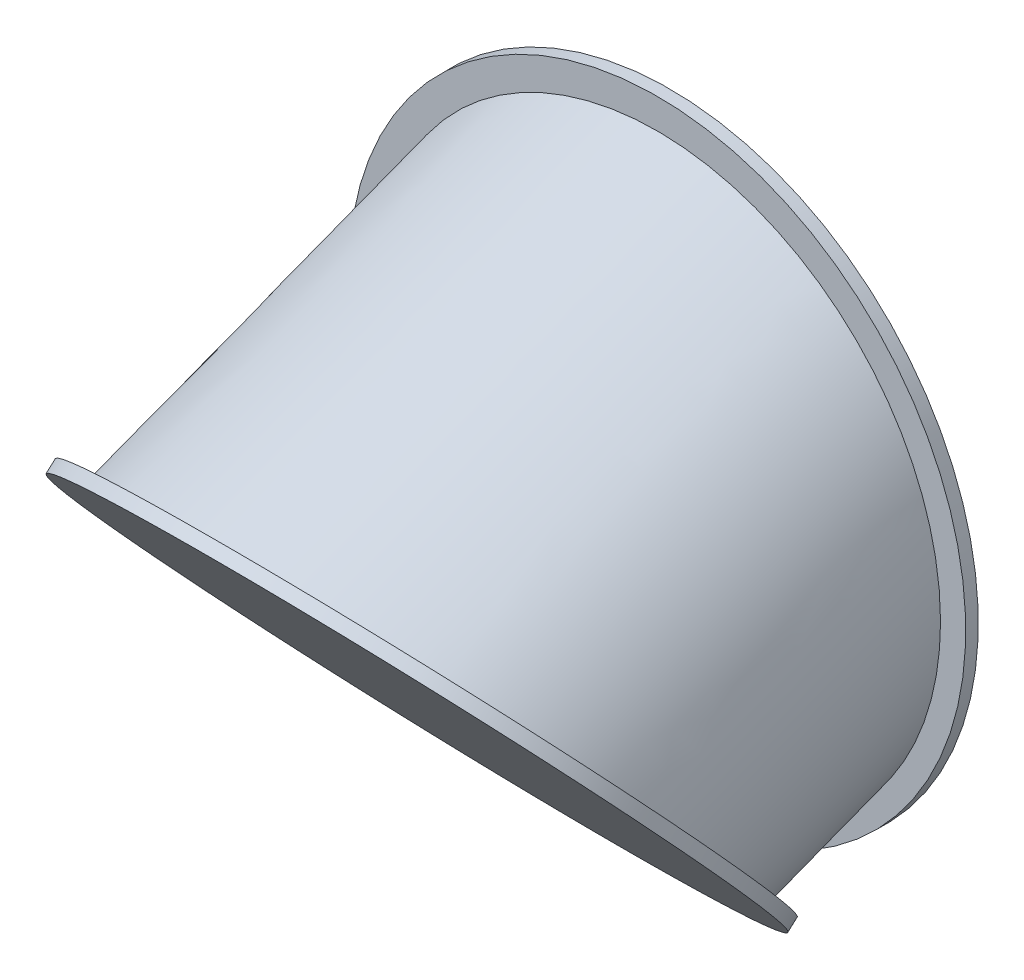
ISO-10303-21;
HEADER;
FILE_DESCRIPTION(('STEP AP214'),'2;1');
FILE_NAME('part.step','',(''),(''),'','','');
FILE_SCHEMA(('AUTOMOTIVE_DESIGN { 1 0 10303 214 1 1 1 1 }'));
ENDSEC;
DATA;
#1=APPLICATION_CONTEXT('core data for automotive mechanical design processes');
#2=APPLICATION_PROTOCOL_DEFINITION('international standard','automotive_design',2000,#1);
#3=PRODUCT_CONTEXT('',#1,'mechanical');
#4=PRODUCT('Part','Part','',(#3));
#5=PRODUCT_RELATED_PRODUCT_CATEGORY('part','',(#4));
#6=PRODUCT_DEFINITION_FORMATION('','',#4);
#7=PRODUCT_DEFINITION_CONTEXT('part definition',#1,'design');
#8=PRODUCT_DEFINITION('design','',#6,#7);
#9=PRODUCT_DEFINITION_SHAPE('','',#8);
#10=(LENGTH_UNIT() NAMED_UNIT(*) SI_UNIT(.MILLI.,.METRE.));
#11=(NAMED_UNIT(*) PLANE_ANGLE_UNIT() SI_UNIT($,.RADIAN.));
#12=(NAMED_UNIT(*) SI_UNIT($,.STERADIAN.) SOLID_ANGLE_UNIT());
#13=UNCERTAINTY_MEASURE_WITH_UNIT(LENGTH_MEASURE(1.E-05),#10,'distance_accuracy_value','');
#14=(GEOMETRIC_REPRESENTATION_CONTEXT(3) GLOBAL_UNCERTAINTY_ASSIGNED_CONTEXT((#13)) GLOBAL_UNIT_ASSIGNED_CONTEXT((#10,
#11,#12)) REPRESENTATION_CONTEXT('',''));
#15=CARTESIAN_POINT('',(0.,0.,0.));
#16=DIRECTION('',(0.,0.,1.));
#17=DIRECTION('',(1.,0.,0.));
#18=AXIS2_PLACEMENT_3D('',#15,#16,#17);
#19=CARTESIAN_POINT('',(11.25,0.,0.));
#20=CARTESIAN_POINT('',(11.25,-8.95919873863236,23.3395106624301));
#21=CARTESIAN_POINT('',(11.25,22.5,0.));
#22=CARTESIAN_POINT('',(11.25,13.5408012613676,23.3395106624301));
#23=CARTESIAN_POINT('',(-11.25,22.5,0.));
#24=CARTESIAN_POINT('',(-11.25,13.5408012613676,23.3395106624301));
#25=CARTESIAN_POINT('',(-11.25,0.,0.));
#26=CARTESIAN_POINT('',(-11.25,-8.95919873863236,23.3395106624301));
#27=CARTESIAN_POINT('',(-11.25,-22.5,0.));
#28=CARTESIAN_POINT('',(-11.25,-31.4591987386324,23.3395106624301));
#29=CARTESIAN_POINT('',(11.25,-22.5,0.));
#30=CARTESIAN_POINT('',(11.25,-31.4591987386324,23.3395106624301));
#31=CARTESIAN_POINT('',(11.25,0.,0.));
#32=CARTESIAN_POINT('',(11.25,-8.95919873863236,23.3395106624301));
#33=(BOUNDED_SURFACE() B_SPLINE_SURFACE(3,1,((#19,#20),(#21,#22),(#23,#24),(#25,#26),(#27,#28),
(#29,#30),(#31,#32)),.UNSPECIFIED.,.T.,.F.,.F.) B_SPLINE_SURFACE_WITH_KNOTS((4,3,4),(2,2),(0.,
0.5,1.),(0.,1.),.UNSPECIFIED.) GEOMETRIC_REPRESENTATION_ITEM() RATIONAL_B_SPLINE_SURFACE(((1.,
1.),(0.333333333333333,0.333333333333333),(0.333333333333333,0.333333333333333),(1.,1.),
(0.333333333333333,0.333333333333333),(0.333333333333333,0.333333333333333),(1.,1.))) REPRESENTATION_ITEM('') SURFACE());
#34=CARTESIAN_POINT('',(11.25,-3.66089560032134,9.53695909538294));
#35=CARTESIAN_POINT('',(11.2500022678552,-3.89578323319594,9.3254653207871));
#36=CARTESIAN_POINT('',(11.2366742815925,-4.13064320830581,9.11399644935448));
#37=CARTESIAN_POINT('',(11.1834553768566,-4.59877220694964,8.69249120572248));
#38=CARTESIAN_POINT('',(11.1435574702997,-4.83204079562755,8.48245522506924));
#39=CARTESIAN_POINT('',(11.037415249348,-5.29549852569795,8.06515601055276));
#40=CARTESIAN_POINT('',(10.9711426176828,-5.52568408152361,7.85789600514838));
#41=CARTESIAN_POINT('',(10.8127241551556,-5.98108472320207,7.44785142560527));
#42=CARTESIAN_POINT('',(10.7205784178198,-6.20629982701887,7.24506683529167));
#43=CARTESIAN_POINT('',(10.5111201408936,-6.65004849572931,6.845513739333));
#44=CARTESIAN_POINT('',(10.393819807899,-6.86858524282454,6.64874236842076));
#45=CARTESIAN_POINT('',(10.1348581064416,-7.2975408770333,6.26250898055484));
#46=CARTESIAN_POINT('',(9.99319635331252,-7.50795963589971,6.07304707907539));
#47=CARTESIAN_POINT('',(9.68655962197015,-7.91912670336061,5.70283058865151));
#48=CARTESIAN_POINT('',(9.52159059470481,-8.11987746295502,5.52207379281684));
#49=CARTESIAN_POINT('',(9.16948533623532,-8.51033830545141,5.17050127109315));
#50=CARTESIAN_POINT('',(8.98234919175702,-8.70004843154406,4.99968550631508));
#51=CARTESIAN_POINT('',(8.58721825651825,-9.06709997242238,4.66919081444248));
#52=CARTESIAN_POINT('',(8.37922125107709,-9.24444007055577,4.509513072867));
#53=CARTESIAN_POINT('',(7.94386363814367,-9.58546883903164,4.20244939050941));
#54=CARTESIAN_POINT('',(7.71650301102852,-9.74915749553955,4.05506346218401));
#55=CARTESIAN_POINT('',(7.24402545928768,-10.0617255912716,3.77362588466837));
#56=CARTESIAN_POINT('',(6.99890784389394,-10.2106044538419,3.63957475469963));
#57=CARTESIAN_POINT('',(6.49266689725298,-10.4924872072486,3.38576638351445));
#58=CARTESIAN_POINT('',(6.23154356913934,-10.6254911011929,3.26600913949958));
#59=CARTESIAN_POINT('',(5.69515264047243,-10.8746760227673,3.04164202833597));
#60=CARTESIAN_POINT('',(5.41988530265197,-10.9908573627326,2.93703187995926));
#61=CARTESIAN_POINT('',(4.8571588791173,-11.2055741379935,2.74370002713583));
#62=CARTESIAN_POINT('',(4.56969979317839,-11.3041095729638,2.65497832298192));
#63=CARTESIAN_POINT('',(3.98463413809857,-11.4828338245604,2.49405428403021));
#64=CARTESIAN_POINT('',(3.68702758948754,-11.5630226783021,2.42185191581354));
#65=CARTESIAN_POINT('',(3.08378225775543,-11.7044839293051,2.29447963329907));
#66=CARTESIAN_POINT('',(2.7781434746436,-11.765756326588,2.23930971898167));
#67=CARTESIAN_POINT('',(2.16100598787761,-11.8689491541492,2.14639447970304));
#68=CARTESIAN_POINT('',(1.84950727302932,-11.9108695474558,2.10864918803128));
#69=CARTESIAN_POINT('',(1.2228650637088,-11.9750601649681,2.05085169641719));
#70=CARTESIAN_POINT('',(0.907721569237623,-11.9973303891795,2.03079949646978));
#71=CARTESIAN_POINT('',(0.276030856508695,-12.0220623180334,2.00853076770645));
#72=CARTESIAN_POINT('',(-0.040516359215199,-12.0245240584176,2.00631420670856));
#73=CARTESIAN_POINT('',(-0.672764622551567,-12.0096216120364,2.01973242970009));
#74=CARTESIAN_POINT('',(-0.988465670165066,-11.9922574252951,2.03536721366788));
#75=CARTESIAN_POINT('',(-1.61677727383375,-11.9378265632173,2.08437698201742));
#76=CARTESIAN_POINT('',(-1.92938782873379,-11.9007598805167,2.11775197302971));
#77=CARTESIAN_POINT('',(-2.54929585605494,-11.8071875435748,2.20200488364661));
#78=CARTESIAN_POINT('',(-2.85659332846903,-11.7506818893077,2.25288280327435));
#79=CARTESIAN_POINT('',(-3.46369081292696,-11.6186332602735,2.37177992290075));
#80=CARTESIAN_POINT('',(-3.76349081704884,-11.5430902653921,2.43979914101036));
#81=CARTESIAN_POINT('',(-4.35346162745393,-11.3735040506772,2.59249525459677));
#82=CARTESIAN_POINT('',(-4.64363243373218,-11.2794608308343,2.67717215008214));
#83=CARTESIAN_POINT('',(-5.21228181285282,-11.0735427914594,2.86258158552916));
#84=CARTESIAN_POINT('',(-5.49076038950559,-10.9616679777387,2.96331412025839));
#85=CARTESIAN_POINT('',(-6.03404559296578,-10.7208820919552,3.18011870562768));
#86=CARTESIAN_POINT('',(-6.29885221978325,-10.591971019905,3.29619075625646));
#87=CARTESIAN_POINT('',(-6.81291080227077,-10.3180291537856,3.54284912041286));
#88=CARTESIAN_POINT('',(-7.06216276424141,-10.172998366246,3.67343542806124));
#89=CARTESIAN_POINT('',(-7.54334010251075,-9.86784810831447,3.94819395442129));
#90=CARTESIAN_POINT('',(-7.7752654788114,-9.7077286379243,4.09236617313143));
#91=CARTESIAN_POINT('',(-8.22014082646417,-9.37353934434707,4.3932715646294));
#92=CARTESIAN_POINT('',(-8.43309079521251,-9.19946951924577,4.55000473914084));
#93=CARTESIAN_POINT('',(-8.83850134558169,-8.838617067355,4.87491774621807));
#94=CARTESIAN_POINT('',(-9.03096192719747,-8.65183444056241,5.0430975787867));
#95=CARTESIAN_POINT('',(-9.39402544771197,-8.26688427247879,5.38970826698233));
#96=CARTESIAN_POINT('',(-9.56462838375228,-8.0687167296989,5.5681391239499));
#97=CARTESIAN_POINT('',(-9.88276369887006,-7.66240560456734,5.93398330426157));
#98=CARTESIAN_POINT('',(-10.0302960779466,-7.45426202221526,6.12139662760602));
#99=CARTESIAN_POINT('',(-10.3012414063335,-7.02947860339864,6.50387333585917));
#100=CARTESIAN_POINT('',(-10.4246543566777,-6.81283876729834,6.6989367204399));
#101=CARTESIAN_POINT('',(-10.646483443318,-6.37260301212593,7.09532677484165));
#102=CARTESIAN_POINT('',(-10.7448995796161,-6.14900709305439,7.29665344466216));
#103=CARTESIAN_POINT('',(-10.9160353544951,-5.69644881522376,7.70413874830133));
#104=CARTESIAN_POINT('',(-10.9887549942344,-5.46748645670659,7.91029738190216));
#105=CARTESIAN_POINT('',(-11.1079807891528,-5.00582307538019,8.32598095755267));
#106=CARTESIAN_POINT('',(-11.1544869443325,-4.77312205257107,8.53550589960225));
#107=CARTESIAN_POINT('',(-11.2209551392363,-4.30563570743227,8.95643249541924));
#108=CARTESIAN_POINT('',(-11.2409171789604,-4.0708503851026,9.16783414918665));
#109=CARTESIAN_POINT('',(-11.2541552248224,-3.60086462381673,9.59101122941084));
#110=CARTESIAN_POINT('',(-11.2474312309596,-3.36566418486053,9.80278665586764));
#111=CARTESIAN_POINT('',(-11.2073450123024,-2.89652031386638,10.2252056946683));
#112=CARTESIAN_POINT('',(-11.1739827863072,-2.6625768818851,10.4358493069612));
#113=CARTESIAN_POINT('',(-11.0808572873355,-2.19761023323667,10.8545071578678));
#114=CARTESIAN_POINT('',(-11.021094014357,-1.96658701656975,11.0625213964814));
#115=CARTESIAN_POINT('',(-10.8755912993729,-1.50910322547974,11.4744416521796));
#116=CARTESIAN_POINT('',(-10.7898518562538,-1.28264265125225,11.678347669088));
#117=CARTESIAN_POINT('',(-10.5930063580493,-0.835894154457032,12.0806018223864));
#118=CARTESIAN_POINT('',(-10.481900302965,-0.615606231889078,12.2789499587766));
#119=CARTESIAN_POINT('',(-10.2351114945383,-0.182769182102589,12.6686781889263));
#120=CARTESIAN_POINT('',(-10.0994287444099,0.0297799461279741,12.8600582835971));
#121=CARTESIAN_POINT('',(-9.80445115917591,0.445628340815452,13.2344898599884));
#122=CARTESIAN_POINT('',(-9.64515632407603,0.648927607274656,13.4175413417111));
#123=CARTESIAN_POINT('',(-9.30408708296652,1.0448309154749,13.7740142815655));
#124=CARTESIAN_POINT('',(-9.12231268004149,1.23743495868351,13.9474357410186));
#125=CARTESIAN_POINT('',(-8.73757659264214,1.61057855174351,14.2834157413137));
#126=CARTESIAN_POINT('',(-8.53461490816545,1.79111810159354,14.4459742821544));
#127=CARTESIAN_POINT('',(-8.10894710667597,2.13884925086652,14.7590728152881));
#128=CARTESIAN_POINT('',(-7.88624098166545,2.30604084488267,14.9096128027128));
#129=CARTESIAN_POINT('',(-7.42266767708822,2.62588736875318,15.1976039063604));
#130=CARTESIAN_POINT('',(-7.18180049750815,2.77854229859685,15.3350550225737));
#131=CARTESIAN_POINT('',(-6.68361742464703,3.06823025570372,15.5958912307371));
#132=CARTESIAN_POINT('',(-6.4263015260055,3.20526327787585,15.7192763181032));
#133=CARTESIAN_POINT('',(-5.89705044943415,3.46273313845017,15.9511032218492));
#134=CARTESIAN_POINT('',(-5.62511527151187,3.58316997686092,16.0595450382366));
#135=CARTESIAN_POINT('',(-5.06855922886471,3.80659111715842,16.2607143365421));
#136=CARTESIAN_POINT('',(-4.78393837754349,3.9095754374849,16.3534418350634));
#137=CARTESIAN_POINT('',(-4.20403420249782,4.09735954057194,16.5225234009378));
#138=CARTESIAN_POINT('',(-3.90875087878745,4.18215932335652,16.5988774683126));
#139=CARTESIAN_POINT('',(-3.30962115604947,4.33297144825111,16.7346693154968));
#140=CARTESIAN_POINT('',(-3.00577476022242,4.39898379738307,16.7941071016289));
#141=CARTESIAN_POINT('',(-2.39167894926367,4.51175178992101,16.8956438581774));
#142=CARTESIAN_POINT('',(-2.08142953412421,4.55850743330366,16.9377428285728));
#143=CARTESIAN_POINT('',(-1.45673280413545,4.63242967692218,17.0043027156905));
#144=CARTESIAN_POINT('',(-1.14228548171259,4.65959624181205,17.0287636005871));
#145=CARTESIAN_POINT('',(-0.51142902213166,4.69414705257719,17.0598732903338));
#146=CARTESIAN_POINT('',(-0.195019884973022,4.70153129844676,17.0665220951788));
#147=CARTESIAN_POINT('',(0.437510115814824,4.69646497841021,17.0619603601282));
#148=CARTESIAN_POINT('',(0.753630979993616,4.68401445039794,17.0507498543523));
#149=CARTESIAN_POINT('',(1.38333761549462,4.63936716926215,17.0105492618507));
#150=CARTESIAN_POINT('',(1.69692338681391,4.60717041611591,16.9815591751046));
#151=CARTESIAN_POINT('',(2.31933106436524,4.52325949865716,16.906005445664));
#152=CARTESIAN_POINT('',(2.62815296095852,4.47154529486034,16.8594417674177));
#153=CARTESIAN_POINT('',(3.23883668911143,4.34896714145572,16.7490719023496));
#154=CARTESIAN_POINT('',(3.54069852079936,4.27810319220088,16.6852657158456));
#155=CARTESIAN_POINT('',(4.13532159079601,4.11772785778048,16.5408631161279));
#156=CARTESIAN_POINT('',(4.42808266001004,4.02821612637162,16.4602663911552));
#157=CARTESIAN_POINT('',(5.00241696166396,3.83118240383305,16.2828564305185));
#158=CARTESIAN_POINT('',(5.28399019191349,3.72366040917731,16.1860431916795));
#159=CARTESIAN_POINT('',(5.83393614359045,3.49137514755833,15.9768926026869));
#160=CARTESIAN_POINT('',(6.10230937836295,3.36661255179848,15.8645558568877));
#161=CARTESIAN_POINT('',(6.62395892488342,3.10072998915161,15.6251541221722));
#162=CARTESIAN_POINT('',(6.87723525193036,2.95961003884131,15.4980891481817));
#163=CARTESIAN_POINT('',(7.36686466113415,2.66203173261018,15.2301484377559));
#164=CARTESIAN_POINT('',(7.60321953879147,2.50557500822942,15.0892741703658));
#165=CARTESIAN_POINT('',(8.05735664801973,2.17842200445667,14.7947042826647));
#166=CARTESIAN_POINT('',(8.27513880692623,2.00772566935837,14.6410086121953));
#167=CARTESIAN_POINT('',(8.690634538264,1.65326195477987,14.321848050032));
#168=CARTESIAN_POINT('',(8.88834298043942,1.46949125418046,14.1563801679888));
#169=CARTESIAN_POINT('',(9.26221903888033,1.09022736583758,13.8148894290688));
#170=CARTESIAN_POINT('',(9.43838699525153,0.894734363251832,13.6388667389087));
#171=CARTESIAN_POINT('',(9.76801294428298,0.493315716627858,13.2774277660319));
#172=CARTESIAN_POINT('',(9.92145989481074,0.28738506484921,13.0920069743255));
#173=CARTESIAN_POINT('',(10.2044499282248,-0.133355257552249,12.713170686436));
#174=CARTESIAN_POINT('',(10.3339929247024,-0.348164960267857,12.5197551613565));
#175=CARTESIAN_POINT('',(10.5681269487923,-0.784903487146056,12.1265140254547));
#176=CARTESIAN_POINT('',(10.6727446600143,-1.00682440695753,11.9266955317421));
#177=CARTESIAN_POINT('',(10.856437713555,-1.4563505826291,11.5219403451497));
#178=CARTESIAN_POINT('',(10.9355197673519,-1.68395432791487,11.3170050123971));
#179=CARTESIAN_POINT('',(11.0840654859646,-2.20051877615799,10.8518882940585));
#180=CARTESIAN_POINT('',(11.1462381213326,-2.49065324853347,10.5906500417414));
#181=CARTESIAN_POINT('',(11.2292039622394,-3.07417139274839,10.0652479447691));
#182=CARTESIAN_POINT('',(11.2499971677782,-3.36755506458783,9.80108410011388));
#183=CARTESIAN_POINT('',(11.25,-3.66089560032134,9.53695909538294));
#184=B_SPLINE_CURVE_WITH_KNOTS('',3,(#34,#35,#36,#37,#38,#39,#40,#41,#42,#43,#44,#45,#46,#47,
#48,#49,#50,#51,#52,#53,#54,#55,#56,#57,#58,#59,#60,#61,#62,#63,#64,#65,#66,#67,#68,#69,#70,#71,
#72,#73,#74,#75,#76,#77,#78,#79,#80,#81,#82,#83,#84,#85,#86,#87,#88,#89,#90,#91,#92,#93,#94,#95,
#96,#97,#98,#99,#100,#101,#102,#103,#104,#105,#106,#107,#108,#109,#110,#111,#112,#113,#114,#115,
#116,#117,#118,#119,#120,#121,#122,#123,#124,#125,#126,#127,#128,#129,#130,#131,#132,#133,#134,
#135,#136,#137,#138,#139,#140,#141,#142,#143,#144,#145,#146,#147,#148,#149,#150,#151,#152,#153,
#154,#155,#156,#157,#158,#159,#160,#161,#162,#163,#164,#165,#166,#167,#168,#169,#170,#171,#172,
#173,#174,#175,#176,#177,#178,#179,#180,#181,#182,#183),.UNSPECIFIED.,.T.,.F.,(4,2,2,2,2,2,2,2,
2,2,2,2,2,2,2,2,2,2,2,2,2,2,2,2,2,2,2,2,2,2,2,2,2,2,2,2,2,2,2,2,2,2,2,2,2,2,2,2,2,2,2,2,2,2,2,2,
2,2,2,2,2,2,2,2,2,2,2,2,2,2,2,2,2,2,4),(0.,0.947872664858294,1.89599472568545,2.84513749761526,
3.79427683862932,4.74295663544547,5.69165141327367,6.64010440115344,7.58855367846108,
8.53710375411264,9.48565479102621,10.4342427475432,11.3828305183476,12.3314006749752,
13.2799708490844,14.2285391042042,15.1771073582326,16.1256774244784,17.0742474904514,
18.0228158448588,18.9713841981165,19.9199529059087,20.8685216149548,21.8170913262336,
22.7656610380011,23.714230440638,24.6627998425779,25.6113688602858,26.5599378778873,
27.5085070256504,28.4570761736474,29.4056454456922,30.3542147177737,31.3027839491883,
32.2513531805263,33.1999223691042,34.1484915576585,35.0970607462124,36.0456299347904,
36.9941991661286,37.9427683975425,38.8913376696233,39.8399069416684,40.7884760896655,
41.737045237428,42.6856142550296,43.6341832727376,44.5827526746773,45.5313220773147,
46.479891789083,47.4284615003615,48.3770302094073,49.3255989172003,50.2741672704584,
51.2227356248656,52.1713056908387,53.1198757570845,54.0684440111122,55.0170122662322,
55.9655824403418,56.9141525969686,57.8627403677721,58.8113283242894,59.7598793612029,
60.708429436854,61.6568787141623,62.6053317020414,63.5540264798676,64.5027062766858,
65.4518456177057,66.4009883896331,67.3491104504593,68.296983115322,69.4807383940221,
70.6644936727221),.UNSPECIFIED.);
#185=CARTESIAN_POINT('',(11.25,-3.66089560032134,9.53695909538294));
#186=VERTEX_POINT('',#185);
#187=EDGE_CURVE('E11',#186,#186,#184,.T.);
#188=CARTESIAN_POINT('',(11.25,-0.191932017517705,0.5));
#189=CARTESIAN_POINT('',(11.2499966427254,0.119566909473019,0.500000000000001));
#190=CARTESIAN_POINT('',(11.2370499644495,0.431151104450768,0.5));
#191=CARTESIAN_POINT('',(11.1853110520358,1.05253050451887,0.5));
#192=CARTESIAN_POINT('',(11.1464850111786,1.36232283422347,0.5));
#193=CARTESIAN_POINT('',(11.0425517941983,1.98163577019439,0.5));
#194=CARTESIAN_POINT('',(10.9771086813149,2.29110021084866,0.5));
#195=CARTESIAN_POINT('',(10.8203758359961,2.90353633570823,0.5));
#196=CARTESIAN_POINT('',(10.7290761122497,3.20650546126776,0.5));
#197=CARTESIAN_POINT('',(10.5211790966431,3.80399685028117,0.5));
#198=CARTESIAN_POINT('',(10.4045551595557,4.09850984412173,0.5));
#199=CARTESIAN_POINT('',(10.1468963230099,4.67665674421297,0.5));
#200=CARTESIAN_POINT('',(10.0058613995766,4.96029063977853,0.5));
#201=CARTESIAN_POINT('',(9.7004607661331,5.51452234986534,0.5));
#202=CARTESIAN_POINT('',(9.53610670871982,5.78512658540836,0.5));
#203=CARTESIAN_POINT('',(9.18517956579498,6.31153181364271,0.5));
#204=CARTESIAN_POINT('',(8.99860595589058,6.56733245674989,0.5));
#205=CARTESIAN_POINT('',(8.60462639124827,7.06223317198781,0.5));
#206=CARTESIAN_POINT('',(8.39722644283955,7.30133802566082,0.5));
#207=CARTESIAN_POINT('',(7.96302484299537,7.76122723103165,0.5));
#208=CARTESIAN_POINT('',(7.73622330407203,7.98201168895697,0.5));
#209=CARTESIAN_POINT('',(7.26480209820096,8.40371690319155,0.5));
#210=CARTESIAN_POINT('',(7.02018036796768,8.60463535297441,0.5));
#211=CARTESIAN_POINT('',(6.51488067197397,8.98515139988143,0.5));
#212=CARTESIAN_POINT('',(6.25420268278073,9.16474896588836,0.5));
#213=CARTESIAN_POINT('',(5.71863039813244,9.5013546636152,0.5));
#214=CARTESIAN_POINT('',(5.44373538452234,9.65836165268253,0.5));
#215=CARTESIAN_POINT('',(4.88169568935884,9.94865906355146,0.5));
#216=CARTESIAN_POINT('',(4.59455101126617,10.0819494920533,0.5));
#217=CARTESIAN_POINT('',(4.01006003053129,10.3238634501861,0.5));
#218=CARTESIAN_POINT('',(3.7127139577731,10.4324875352427,0.5));
#219=CARTESIAN_POINT('',(3.10992801485678,10.6243003907354,0.5));
#220=CARTESIAN_POINT('',(2.80448814447033,10.707489160454,0.5));
#221=CARTESIAN_POINT('',(2.18768793516424,10.8478395424021,0.5));
#222=CARTESIAN_POINT('',(1.87632763099108,10.9050013073325,0.5));
#223=CARTESIAN_POINT('',(1.24989838547916,10.9928920141321,0.5));
#224=CARTESIAN_POINT('',(0.934829444157716,11.0236209561246,0.5));
#225=CARTESIAN_POINT('',(0.30322182330229,11.0584276112504,0.5));
#226=CARTESIAN_POINT('',(-0.0133168610558856,11.062505236843,0.5));
#227=CARTESIAN_POINT('',(-0.645612537953599,11.0439800372613,0.5));
#228=CARTESIAN_POINT('',(-0.961369530491453,11.0213772120294,0.5));
#229=CARTESIAN_POINT('',(-1.58985675467657,10.9496518289935,0.5));
#230=CARTESIAN_POINT('',(-1.902586988479,10.9005292900738,0.5));
#231=CARTESIAN_POINT('',(-2.52279760019098,10.7761137235142,0.5));
#232=CARTESIAN_POINT('',(-2.83027797810529,10.7008206958981,0.5));
#233=CARTESIAN_POINT('',(-3.43780286815756,10.524599442882,0.5));
#234=CARTESIAN_POINT('',(-3.73784738055048,10.4236712183611,0.5));
#235=CARTESIAN_POINT('',(-4.32836741558546,10.1968971089075,0.5));
#236=CARTESIAN_POINT('',(-4.61884293822161,10.0710512239593,0.5));
#237=CARTESIAN_POINT('',(-5.18816011043437,9.79533637413978,0.5));
#238=CARTESIAN_POINT('',(-5.46700175093926,9.64546739053647,0.5));
#239=CARTESIAN_POINT('',(-6.01106852011907,9.32277189299933,0.5));
#240=CARTESIAN_POINT('',(-6.27629364878702,9.14994537905373,0.5));
#241=CARTESIAN_POINT('',(-6.79124174478667,8.78256355486131,0.5));
#242=CARTESIAN_POINT('',(-7.04096471549684,8.58800824934998,0.5));
#243=CARTESIAN_POINT('',(-7.52313317710172,8.17855198368496,0.5));
#244=CARTESIAN_POINT('',(-7.75557866800665,7.96365102354331,0.5));
#245=CARTESIAN_POINT('',(-8.20153954455714,7.51503134334375,0.5));
#246=CARTESIAN_POINT('',(-8.41505493671495,7.28131262975948,0.5));
#247=CARTESIAN_POINT('',(-8.82163773965616,6.79671897790511,0.5));
#248=CARTESIAN_POINT('',(-9.01470515044175,6.54584403963686,0.5));
#249=CARTESIAN_POINT('',(-9.3790194177189,6.02872147950764,0.5));
#250=CARTESIAN_POINT('',(-9.5502662717863,5.76247385593885,0.5));
#251=CARTESIAN_POINT('',(-9.86972193819672,5.21649881136944,0.5));
#252=CARTESIAN_POINT('',(-10.0179307505348,4.93677139036594,0.5));
#253=CARTESIAN_POINT('',(-10.2902566742933,4.36582541021584,0.5));
#254=CARTESIAN_POINT('',(-10.414373782776,4.07460684966801,0.5));
#255=CARTESIAN_POINT('',(-10.6376338779828,3.48274901222406,0.5));
#256=CARTESIAN_POINT('',(-10.7367768647059,3.18210973532753,0.5));
#257=CARTESIAN_POINT('',(-10.9093838660694,2.57354784108521,0.5));
#258=CARTESIAN_POINT('',(-10.9828478815958,2.26562522399075,0.5));
#259=CARTESIAN_POINT('',(-11.1035746601598,1.64468578480127,0.5));
#260=CARTESIAN_POINT('',(-11.1508374231994,1.33166896270663,0.5));
#261=CARTESIAN_POINT('',(-11.218825685045,0.702766492355041,0.5));
#262=CARTESIAN_POINT('',(-11.2395511852566,0.38688084425004,0.5));
#263=CARTESIAN_POINT('',(-11.2543175801866,-0.245513536904068,0.5));
#264=CARTESIAN_POINT('',(-11.248358474906,-0.562022269953147,0.5));
#265=CARTESIAN_POINT('',(-11.2097980247344,-1.19341263006086,0.5));
#266=CARTESIAN_POINT('',(-11.1771966801474,-1.50829425713805,0.5));
#267=CARTESIAN_POINT('',(-11.085583527771,-2.13419178941033,0.5));
#268=CARTESIAN_POINT('',(-11.0265717199809,-2.44520769460529,0.5));
#269=CARTESIAN_POINT('',(-10.8825571742792,-3.06116266988801,0.5));
#270=CARTESIAN_POINT('',(-10.7975544343984,-3.36610173951532,0.5));
#271=CARTESIAN_POINT('',(-10.6021623446419,-3.96773508516932,0.5));
#272=CARTESIAN_POINT('',(-10.4917729947629,-4.26442936119488,0.5));
#273=CARTESIAN_POINT('',(-10.2463924784424,-4.84746382170414,0.5));
#274=CARTESIAN_POINT('',(-10.1114013102473,-5.13380400544974,0.5));
#275=CARTESIAN_POINT('',(-9.81777686910379,-5.69409455153576,0.5));
#276=CARTESIAN_POINT('',(-9.65914359615711,-5.96804491387706,0.5));
#277=CARTESIAN_POINT('',(-9.31936277035739,-6.50160813547875,0.5));
#278=CARTESIAN_POINT('',(-9.13821522241848,-6.76122099786852,0.5));
#279=CARTESIAN_POINT('',(-8.75469366971177,-7.26426359258246,0.5));
#280=CARTESIAN_POINT('',(-8.5523196649521,-7.50769332491283,0.5));
#281=CARTESIAN_POINT('',(-8.12778399617146,-7.97663897617885,0.5));
#282=CARTESIAN_POINT('',(-7.90562233587895,-8.20215489848989,0.5));
#283=CARTESIAN_POINT('',(-7.44309075883785,-8.63366969862077,0.5));
#284=CARTESIAN_POINT('',(-7.20272084208537,-8.83966857643645,0.5));
#285=CARTESIAN_POINT('',(-6.70548148908511,-9.2306848761702,0.5));
#286=CARTESIAN_POINT('',(-6.44861204302135,-9.41570228560569,0.5));
#287=CARTESIAN_POINT('',(-5.92019994861298,-9.76344014363317,0.5));
#288=CARTESIAN_POINT('',(-5.64865730025456,-9.92616059220419,0.5));
#289=CARTESIAN_POINT('',(-5.09282922708681,-10.228147726735,0.5));
#290=CARTESIAN_POINT('',(-4.80854379856656,-10.3674144058646,0.5));
#291=CARTESIAN_POINT('',(-4.22925134029979,-10.6215038399194,0.5));
#292=CARTESIAN_POINT('',(-3.93424431056293,-10.7363265948666,0.5));
#293=CARTESIAN_POINT('',(-3.33560632811045,-10.9407117383408,0.5));
#294=CARTESIAN_POINT('',(-3.03197538554777,-11.0302741566055,0.5));
#295=CARTESIAN_POINT('',(-2.41824787672993,-11.1835020722829,0.5));
#296=CARTESIAN_POINT('',(-2.1081513104785,-11.2471675697106,0.5));
#297=CARTESIAN_POINT('',(-1.48369696976011,-11.3481490502358,0.5));
#298=CARTESIAN_POINT('',(-1.1693391928034,-11.3854650179372,0.5));
#299=CARTESIAN_POINT('',(-0.538597503111475,-11.4334820845341,0.5));
#300=CARTESIAN_POINT('',(-0.222213590372416,-11.4441831833793,0.5));
#301=CARTESIAN_POINT('',(0.410331073567252,-11.4388944337464,0.5));
#302=CARTESIAN_POINT('',(0.726491824765421,-11.4229045849765,0.5));
#303=CARTESIAN_POINT('',(1.35634244692464,-11.3643476178489,0.5));
#304=CARTESIAN_POINT('',(1.67003231790452,-11.3217804996936,0.5));
#305=CARTESIAN_POINT('',(2.29270848573378,-11.2103720769693,0.5));
#306=CARTESIAN_POINT('',(2.60169482103442,-11.1415309873094,0.5));
#307=CARTESIAN_POINT('',(3.2127698732936,-10.9780640066429,0.5));
#308=CARTESIAN_POINT('',(3.51485859019241,-10.883438115413,0.5));
#309=CARTESIAN_POINT('',(4.10999564228368,-10.669072497388,0.5));
#310=CARTESIAN_POINT('',(4.40304382950331,-10.5493323597797,0.5));
#311=CARTESIAN_POINT('',(4.9780112093648,-10.285590482998,0.5));
#312=CARTESIAN_POINT('',(5.25993040230994,-10.1415887444857,0.5));
#313=CARTESIAN_POINT('',(5.8106490709415,-9.83033977192884,0.5));
#314=CARTESIAN_POINT('',(6.07944789973167,-9.66309139327568,0.5));
#315=CARTESIAN_POINT('',(6.60199987034637,-9.30654360921738,0.5));
#316=CARTESIAN_POINT('',(6.85575300562653,-9.1172441942209,0.5));
#317=CARTESIAN_POINT('',(7.34638114155395,-8.71796321809282,0.5));
#318=CARTESIAN_POINT('',(7.58325806849591,-8.50798402394464,0.5));
#319=CARTESIAN_POINT('',(8.03848135063554,-8.06881851899498,0.5));
#320=CARTESIAN_POINT('',(8.256827748567,-7.83963225248991,0.5));
#321=CARTESIAN_POINT('',(8.67338889050578,-7.36373800102964,0.5));
#322=CARTESIAN_POINT('',(8.87160840653453,-7.1170341931124,0.5));
#323=CARTESIAN_POINT('',(9.24656812199509,-6.60780729041055,0.5));
#324=CARTESIAN_POINT('',(9.42330813448997,-6.34528405797864,0.5));
#325=CARTESIAN_POINT('',(9.75414991257978,-5.80612444855462,0.5));
#326=CARTESIAN_POINT('',(9.90823809401376,-5.5294797358752,0.5));
#327=CARTESIAN_POINT('',(10.1925490188687,-4.96419920561389,0.5));
#328=CARTESIAN_POINT('',(10.322772587292,-4.67556380297477,0.5));
#329=CARTESIAN_POINT('',(10.5585506788223,-4.08805791097566,0.5));
#330=CARTESIAN_POINT('',(10.664080796671,-3.78917762789078,0.5));
#331=CARTESIAN_POINT('',(10.8495539011556,-3.18358025123311,0.5));
#332=CARTESIAN_POINT('',(10.9294971327959,-2.87686323273048,0.5));
#333=CARTESIAN_POINT('',(11.0630799993847,-2.25847967670477,0.5));
#334=CARTESIAN_POINT('',(11.1167776161875,-1.94682563432664,0.5));
#335=CARTESIAN_POINT('',(11.1977286164753,-1.32023310057764,0.5));
#336=CARTESIAN_POINT('',(11.2249969140567,-1.00529656306382,0.5));
#337=CARTESIAN_POINT('',(11.246326106432,-0.523984498227108,0.5));
#338=CARTESIAN_POINT('',(11.250001789529,-0.357970371096212,0.5));
#339=CARTESIAN_POINT('',(11.25,-0.191932017517705,0.5));
#340=B_SPLINE_CURVE_WITH_KNOTS('',3,(#188,#189,#190,#191,#192,#193,#194,#195,#196,#197,#198,
#199,#200,#201,#202,#203,#204,#205,#206,#207,#208,#209,#210,#211,#212,#213,#214,#215,#216,#217,
#218,#219,#220,#221,#222,#223,#224,#225,#226,#227,#228,#229,#230,#231,#232,#233,#234,#235,#236,
#237,#238,#239,#240,#241,#242,#243,#244,#245,#246,#247,#248,#249,#250,#251,#252,#253,#254,#255,
#256,#257,#258,#259,#260,#261,#262,#263,#264,#265,#266,#267,#268,#269,#270,#271,#272,#273,#274,
#275,#276,#277,#278,#279,#280,#281,#282,#283,#284,#285,#286,#287,#288,#289,#290,#291,#292,#293,
#294,#295,#296,#297,#298,#299,#300,#301,#302,#303,#304,#305,#306,#307,#308,#309,#310,#311,#312,
#313,#314,#315,#316,#317,#318,#319,#320,#321,#322,#323,#324,#325,#326,#327,#328,#329,#330,#331,
#332,#333,#334,#335,#336,#337,#338,#339),.UNSPECIFIED.,.T.,.F.,(4,2,2,2,2,2,2,2,2,2,2,2,2,2,2,2,
2,2,2,2,2,2,2,2,2,2,2,2,2,2,2,2,2,2,2,2,2,2,2,2,2,2,2,2,2,2,2,2,2,2,2,2,2,2,2,2,2,2,2,2,2,2,2,2,
2,2,2,2,2,2,2,2,2,2,2,4),(0.,0.934375666753729,1.86997432521442,2.81776699940733,
3.76592641317052,4.71508832233822,5.66425116371921,6.61294136697498,7.56165396424448,
8.51009373376217,9.45852800353787,10.4070722615013,11.3556179038219,12.3042115076174,
13.2528048434225,14.2013768171106,15.1499488175589,16.0985152526451,17.0470816833068,
17.9956512296913,18.9442207781197,19.8927896510837,20.8413585231908,21.7899273627754,
22.7384962029476,23.6870657827689,24.6356353630763,25.5842047366563,26.5327741096749,
27.4813431563699,28.4299122029629,29.3784813549364,30.3270505071128,31.2756197749595,
32.2241890428486,33.1727582780072,34.1213275130931,35.0698966979341,36.0184658827327,
36.967035056711,37.9156042307204,38.8641734766035,39.8127427226171,40.7613120362506,
41.7098813498167,42.6584504563415,43.6070195625034,44.555588489933,45.5041574175656,
46.4527269095312,47.4012964023898,48.34986617149,49.2984359397362,50.2470045912788,
51.1955732422746,52.1441424475218,53.0927116545638,54.0412808719734,54.9898500821585,
55.9384115336526,56.8869729933596,57.8355499706254,58.784126922043,59.7327505956632,
60.681374681899,61.629890315639,62.5784037619203,63.5266917908773,64.4749880722295,
65.4238507411108,66.3726806015154,67.3224442942921,68.2721988924381,69.2198456992475,
70.1669574359525,70.6650079391449),.UNSPECIFIED.);
#341=CARTESIAN_POINT('',(11.25,-0.191932017517704,0.5));
#342=VERTEX_POINT('',#341);
#343=EDGE_CURVE('E44',#342,#342,#340,.T.);
#344=CARTESIAN_POINT('',(11.25,-3.66089560032134,9.53695909538294));
#345=CARTESIAN_POINT('',(11.25,-3.62476056300047,9.44282410480603));
#346=CARTESIAN_POINT('',(11.25,-3.58862552567959,9.34868911422913));
#347=CARTESIAN_POINT('',(11.25,-3.51635545103785,9.16041913307532));
#348=CARTESIAN_POINT('',(11.25,-3.48022041371698,9.06628414249841));
#349=CARTESIAN_POINT('',(11.25,-3.40795033907524,8.8780141613446));
#350=CARTESIAN_POINT('',(11.25,-3.37181530175437,8.7838791707677));
#351=CARTESIAN_POINT('',(11.25,-3.29954522711262,8.59560918961389));
#352=CARTESIAN_POINT('',(11.25,-3.26341018979175,8.50147419903698));
#353=CARTESIAN_POINT('',(11.25,-3.19114011515001,8.31320421788317));
#354=CARTESIAN_POINT('',(11.25,-3.15500507782914,8.21906922730626));
#355=CARTESIAN_POINT('',(11.25,-3.0827350031874,8.03079924615245));
#356=CARTESIAN_POINT('',(11.25,-3.04659996586653,7.93666425557555));
#357=CARTESIAN_POINT('',(11.25,-2.97432989122478,7.74839427442174));
#358=CARTESIAN_POINT('',(11.25,-2.93819485390391,7.65425928384483));
#359=CARTESIAN_POINT('',(11.25,-2.86592477926217,7.46598930269102));
#360=CARTESIAN_POINT('',(11.25,-2.8297897419413,7.37185431211411));
#361=CARTESIAN_POINT('',(11.25,-2.75751966729956,7.1835843309603));
#362=CARTESIAN_POINT('',(11.25,-2.72138462997869,7.08944934038339));
#363=CARTESIAN_POINT('',(11.25,-2.64911455533694,6.90117935922958));
#364=CARTESIAN_POINT('',(11.25,-2.61297951801607,6.80704436865268));
#365=CARTESIAN_POINT('',(11.25,-2.54070944337433,6.61877438749887));
#366=CARTESIAN_POINT('',(11.25,-2.50457440605346,6.52463939692196));
#367=CARTESIAN_POINT('',(11.25,-2.43230433141172,6.33636941576815));
#368=CARTESIAN_POINT('',(11.25,-2.39616929409085,6.24223442519124));
#369=CARTESIAN_POINT('',(11.25,-2.3238992194491,6.05396444403743));
#370=CARTESIAN_POINT('',(11.25,-2.28776418212823,5.95982945346053));
#371=CARTESIAN_POINT('',(11.25,-2.21549410748649,5.77155947230672));
#372=CARTESIAN_POINT('',(11.25,-2.17935907016562,5.67742448172981));
#373=CARTESIAN_POINT('',(11.25,-2.10708899552388,5.489154500576));
#374=CARTESIAN_POINT('',(11.25,-2.07095395820301,5.39501950999909));
#375=CARTESIAN_POINT('',(11.25,-1.99868388356126,5.20674952884528));
#376=CARTESIAN_POINT('',(11.25,-1.96254884624039,5.11261453826838));
#377=CARTESIAN_POINT('',(11.25,-1.89027877159865,4.92434455711456));
#378=CARTESIAN_POINT('',(11.25,-1.85414373427778,4.83020956653766));
#379=CARTESIAN_POINT('',(11.25,-1.78187365963604,4.64193958538385));
#380=CARTESIAN_POINT('',(11.25,-1.74573862231516,4.54780459480694));
#381=CARTESIAN_POINT('',(11.25,-1.67346854767342,4.35953461365313));
#382=CARTESIAN_POINT('',(11.25,-1.63733351035255,4.26539962307623));
#383=CARTESIAN_POINT('',(11.25,-1.56506343571081,4.07712964192241));
#384=CARTESIAN_POINT('',(11.25,-1.52892839838994,3.98299465134551));
#385=CARTESIAN_POINT('',(11.25,-1.4566583237482,3.7947246701917));
#386=CARTESIAN_POINT('',(11.25,-1.42052328642732,3.70058967961479));
#387=CARTESIAN_POINT('',(11.25,-1.34825321178558,3.51231969846098));
#388=CARTESIAN_POINT('',(11.25,-1.31211817446471,3.41818470788407));
#389=CARTESIAN_POINT('',(11.25,-1.23984809982297,3.22991472673026));
#390=CARTESIAN_POINT('',(11.25,-1.2037130625021,3.13577973615336));
#391=CARTESIAN_POINT('',(11.25,-1.13144298786035,2.94750975499955));
#392=CARTESIAN_POINT('',(11.25,-1.09530795053948,2.85337476442264));
#393=CARTESIAN_POINT('',(11.25,-1.02303787589774,2.66510478326883));
#394=CARTESIAN_POINT('',(11.25,-0.98690283857687,2.57096979269192));
#395=CARTESIAN_POINT('',(11.25,-0.914632763935128,2.38269981153811));
#396=CARTESIAN_POINT('',(11.25,-0.878497726614257,2.28856482096121));
#397=CARTESIAN_POINT('',(11.25,-0.806227651972514,2.1002948398074));
#398=CARTESIAN_POINT('',(11.25,-0.770092614651643,2.00615984923049));
#399=CARTESIAN_POINT('',(11.25,-0.697822540009901,1.81788986807668));
#400=CARTESIAN_POINT('',(11.25,-0.66168750268903,1.72375487749977));
#401=CARTESIAN_POINT('',(11.25,-0.589417428047287,1.53548489634596));
#402=CARTESIAN_POINT('',(11.25,-0.553282390726416,1.44134990576906));
#403=CARTESIAN_POINT('',(11.25,-0.481012316084674,1.25307992461525));
#404=CARTESIAN_POINT('',(11.25,-0.444877278763803,1.15894493403834));
#405=CARTESIAN_POINT('',(11.25,-0.37260720412206,0.970674952884528));
#406=CARTESIAN_POINT('',(11.25,-0.336472166801189,0.876539962307623));
#407=CARTESIAN_POINT('',(11.25,-0.264202092159447,0.688269981153812));
#408=CARTESIAN_POINT('',(11.25,-0.228067054838576,0.594134990576906));
#409=CARTESIAN_POINT('',(11.25,-0.191932017517704,0.5));
#410=B_SPLINE_CURVE_WITH_KNOTS('',3,(#344,#345,#346,#347,#348,#349,#350,#351,#352,#353,#354,
#355,#356,#357,#358,#359,#360,#361,#362,#363,#364,#365,#366,#367,#368,#369,#370,#371,#372,#373,
#374,#375,#376,#377,#378,#379,#380,#381,#382,#383,#384,#385,#386,#387,#388,#389,#390,#391,#392,
#393,#394,#395,#396,#397,#398,#399,#400,#401,#402,#403,#404,#405,#406,#407,#408,#409),
.UNSPECIFIED.,.F.,.F.,(4,2,2,2,2,2,2,2,2,2,2,2,2,2,2,2,2,2,2,2,2,2,2,2,2,2,2,2,2,2,2,2,4),(0.,
0.302496671647563,0.604993343295126,0.90749001494269,1.20998668659025,1.51248335823782,
1.81498002988538,2.11747670153294,2.41997337318051,2.72247004482807,3.02496671647563,
3.3274633881232,3.62996005977076,3.93245673141833,4.23495340306589,4.53745007471345,
4.83994674636102,5.14244341800858,5.44494008965614,5.7474367613037,6.04993343295127,
6.35243010459883,6.6549267762464,6.95742344789396,7.25992011954152,7.56241679118909,
7.86491346283665,8.16741013448421,8.46990680613177,8.77240347777934,9.0749001494269,
9.37739682107446,9.67989349272203),.UNSPECIFIED.);
#411=EDGE_CURVE('BSEAM40',#186,#342,#410,.T.);
#412=ORIENTED_EDGE('',*,*,#187,.T.);
#413=ORIENTED_EDGE('',*,*,#343,.T.);
#414=ORIENTED_EDGE('',*,*,#411,.T.);
#415=ORIENTED_EDGE('',*,*,#411,.F.);
#416=EDGE_LOOP('',(#412,#414,#413,#415));
#417=FACE_BOUND('',#416,.T.);
#418=ADVANCED_FACE('F40',(#417),#33,.T.);
#419=CARTESIAN_POINT('',(0.,-3.51826231465961,9.66538668264425));
#420=DIRECTION('',(0.,-0.669130606358859,0.743144825477393));
#421=DIRECTION('',(0.,-0.743144825477393,-0.669130606358859));
#422=AXIS2_PLACEMENT_3D('',#419,#420,#421);
#423=CYLINDRICAL_SURFACE('',#422,12.25);
#424=CARTESIAN_POINT('',(0.,-3.51826231465961,9.66538668264425));
#425=DIRECTION('',(0.,-0.669130606358859,0.743144825477393));
#426=DIRECTION('',(0.,-0.743144825477393,-0.669130606358859));
#427=AXIS2_PLACEMENT_3D('',#424,#425,#426);
#428=CIRCLE('',#427,12.25);
#429=CARTESIAN_POINT('',(0.,-12.6217864267577,1.4685367547482));
#430=VERTEX_POINT('',#429);
#431=EDGE_CURVE('E52',#430,#430,#428,.T.);
#432=ORIENTED_EDGE('',*,*,#431,.T.);
#433=EDGE_LOOP('',(#432));
#434=FACE_BOUND('',#433,.T.);
#435=CARTESIAN_POINT('',(0.,-3.85282761783904,10.0369590953829));
#436=DIRECTION('',(0.,-0.669130606358859,0.743144825477393));
#437=DIRECTION('',(0.,-0.743144825477393,-0.669130606358859));
#438=AXIS2_PLACEMENT_3D('',#435,#436,#437);
#439=CIRCLE('',#438,12.25);
#440=CARTESIAN_POINT('',(0.,-12.9563517299371,1.84010916748689));
#441=VERTEX_POINT('',#440);
#442=EDGE_CURVE('E56',#441,#441,#439,.T.);
#443=ORIENTED_EDGE('',*,*,#442,.F.);
#444=EDGE_LOOP('',(#443));
#445=FACE_BOUND('',#444,.T.);
#446=ADVANCED_FACE('F73',(#434,#445),#423,.T.);
#447=CARTESIAN_POINT('',(0.,-3.51826231465961,9.66538668264425));
#448=DIRECTION('',(0.,-0.669130606358859,0.743144825477393));
#449=DIRECTION('',(0.,-0.743144825477393,-0.669130606358859));
#450=AXIS2_PLACEMENT_3D('',#447,#448,#449);
#451=PLANE('',#450);
#452=ORIENTED_EDGE('',*,*,#187,.F.);
#453=EDGE_LOOP('',(#452));
#454=FACE_BOUND('',#453,.T.);
#455=ORIENTED_EDGE('',*,*,#431,.F.);
#456=EDGE_LOOP('',(#455));
#457=FACE_BOUND('',#456,.T.);
#458=ADVANCED_FACE('F67',(#454,#457),#451,.F.);
#459=CARTESIAN_POINT('',(0.,-6.71603652549262,7.45891421526205));
#460=DIRECTION('',(0.,-0.669130606358859,0.743144825477393));
#461=DIRECTION('',(0.,-0.743144825477393,-0.669130606358859));
#462=AXIS2_PLACEMENT_3D('',#459,#460,#461);
#463=PLANE('',#462);
#464=ORIENTED_EDGE('',*,*,#442,.T.);
#465=EDGE_LOOP('',(#464));
#466=FACE_BOUND('',#465,.T.);
#467=ADVANCED_FACE('F72',(#466),#463,.T.);
#468=CARTESIAN_POINT('',(0.,0.,0.5));
#469=DIRECTION('',(0.,0.,-1.));
#470=DIRECTION('',(-1.,0.,0.));
#471=AXIS2_PLACEMENT_3D('',#468,#469,#470);
#472=CYLINDRICAL_SURFACE('',#471,12.25);
#473=CARTESIAN_POINT('',(0.,0.,0.5));
#474=DIRECTION('',(0.,0.,-1.));
#475=DIRECTION('',(-1.,0.,0.));
#476=AXIS2_PLACEMENT_3D('',#473,#474,#475);
#477=CIRCLE('',#476,12.25);
#478=CARTESIAN_POINT('',(-12.25,0.,0.5));
#479=VERTEX_POINT('',#478);
#480=EDGE_CURVE('E93',#479,#479,#477,.T.);
#481=ORIENTED_EDGE('',*,*,#480,.T.);
#482=EDGE_LOOP('',(#481));
#483=FACE_BOUND('',#482,.T.);
#484=CARTESIAN_POINT('',(0.,0.,0.));
#485=DIRECTION('',(0.,0.,-1.));
#486=DIRECTION('',(-1.,0.,0.));
#487=AXIS2_PLACEMENT_3D('',#484,#485,#486);
#488=CIRCLE('',#487,12.25);
#489=CARTESIAN_POINT('',(-12.25,0.,0.));
#490=VERTEX_POINT('',#489);
#491=EDGE_CURVE('E95',#490,#490,#488,.T.);
#492=ORIENTED_EDGE('',*,*,#491,.F.);
#493=EDGE_LOOP('',(#492));
#494=FACE_BOUND('',#493,.T.);
#495=ADVANCED_FACE('F75',(#483,#494),#472,.T.);
#496=CARTESIAN_POINT('',(0.,0.,0.5));
#497=DIRECTION('',(0.,0.,-1.));
#498=DIRECTION('',(-1.,0.,0.));
#499=AXIS2_PLACEMENT_3D('',#496,#497,#498);
#500=PLANE('',#499);
#501=ORIENTED_EDGE('',*,*,#343,.F.);
#502=EDGE_LOOP('',(#501));
#503=FACE_BOUND('',#502,.T.);
#504=ORIENTED_EDGE('',*,*,#480,.F.);
#505=EDGE_LOOP('',(#504));
#506=FACE_BOUND('',#505,.T.);
#507=ADVANCED_FACE('F84',(#503,#506),#500,.F.);
#508=CARTESIAN_POINT('',(0.,0.,0.));
#509=DIRECTION('',(0.,0.,1.));
#510=DIRECTION('',(1.,0.,0.));
#511=AXIS2_PLACEMENT_3D('',#508,#509,#510);
#512=PLANE('',#511);
#513=ORIENTED_EDGE('',*,*,#491,.T.);
#514=EDGE_LOOP('',(#513));
#515=FACE_BOUND('',#514,.T.);
#516=ADVANCED_FACE('F42',(#515),#512,.F.);
#517=CLOSED_SHELL('',(#418,#446,#458,#467,#495,#507,#516));
#518=MANIFOLD_SOLID_BREP('B2',#517);
#519=ADVANCED_BREP_SHAPE_REPRESENTATION('',(#18,#518),#14);
#520=SHAPE_DEFINITION_REPRESENTATION(#9,#519);
ENDSEC;
END-ISO-10303-21;
